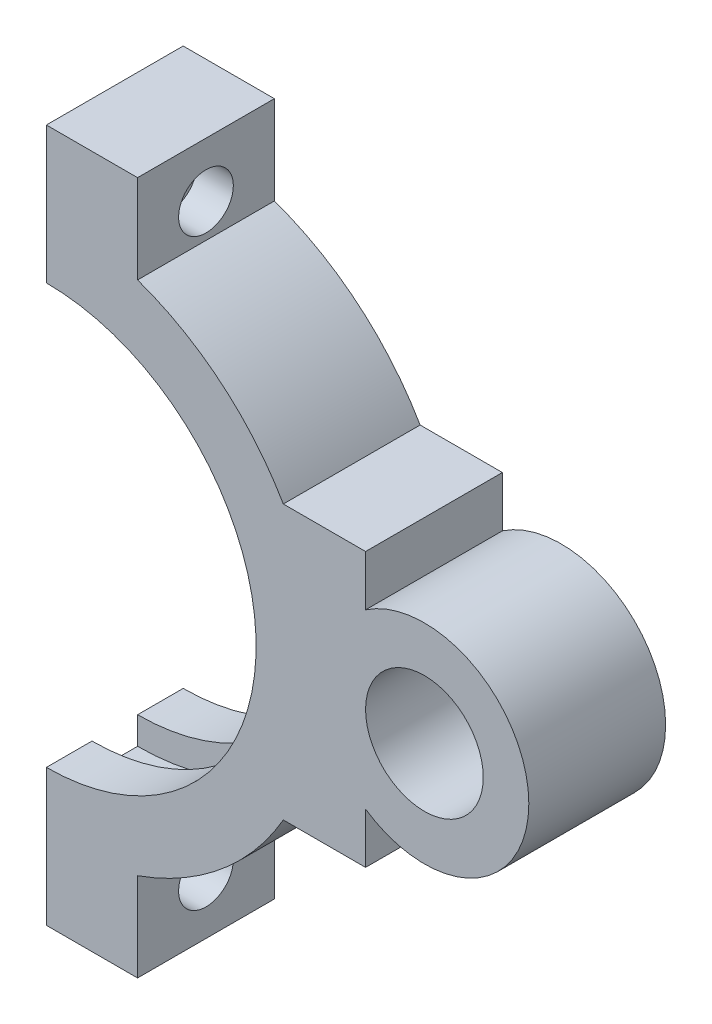
ISO-10303-21;
HEADER;
FILE_DESCRIPTION(('STEP AP214'),'2;1');
FILE_NAME('part.step','',(''),(''),'','','');
FILE_SCHEMA(('AUTOMOTIVE_DESIGN { 1 0 10303 214 1 1 1 1 }'));
ENDSEC;
DATA;
#1=APPLICATION_CONTEXT('core data for automotive mechanical design processes');
#2=APPLICATION_PROTOCOL_DEFINITION('international standard','automotive_design',2000,#1);
#3=PRODUCT_CONTEXT('',#1,'mechanical');
#4=PRODUCT('Part','Part','',(#3));
#5=PRODUCT_RELATED_PRODUCT_CATEGORY('part','',(#4));
#6=PRODUCT_DEFINITION_FORMATION('','',#4);
#7=PRODUCT_DEFINITION_CONTEXT('part definition',#1,'design');
#8=PRODUCT_DEFINITION('design','',#6,#7);
#9=PRODUCT_DEFINITION_SHAPE('','',#8);
#10=(LENGTH_UNIT() NAMED_UNIT(*) SI_UNIT(.MILLI.,.METRE.));
#11=(NAMED_UNIT(*) PLANE_ANGLE_UNIT() SI_UNIT($,.RADIAN.));
#12=(NAMED_UNIT(*) SI_UNIT($,.STERADIAN.) SOLID_ANGLE_UNIT());
#13=UNCERTAINTY_MEASURE_WITH_UNIT(LENGTH_MEASURE(1.E-05),#10,'distance_accuracy_value','');
#14=(GEOMETRIC_REPRESENTATION_CONTEXT(3) GLOBAL_UNCERTAINTY_ASSIGNED_CONTEXT((#13)) GLOBAL_UNIT_ASSIGNED_CONTEXT((#10,
#11,#12)) REPRESENTATION_CONTEXT('',''));
#15=CARTESIAN_POINT('',(0.,0.,0.));
#16=DIRECTION('',(0.,0.,1.));
#17=DIRECTION('',(1.,0.,0.));
#18=AXIS2_PLACEMENT_3D('',#15,#16,#17);
#19=CARTESIAN_POINT('',(15.,32.4850746268657,2.5));
#20=DIRECTION('',(-1.,0.,0.));
#21=DIRECTION('',(0.,0.,1.));
#22=AXIS2_PLACEMENT_3D('',#19,#20,#21);
#23=CYLINDRICAL_SURFACE('',#22,1.6);
#24=CARTESIAN_POINT('',(0.,32.4850746268657,2.5));
#25=DIRECTION('',(-1.,0.,0.));
#26=DIRECTION('',(0.,0.,1.));
#27=AXIS2_PLACEMENT_3D('',#24,#25,#26);
#28=CIRCLE('',#27,1.6);
#29=CARTESIAN_POINT('',(0.,32.4850746268657,4.1));
#30=VERTEX_POINT('',#29);
#31=EDGE_CURVE('E331',#30,#30,#28,.T.);
#32=ORIENTED_EDGE('',*,*,#31,.T.);
#33=EDGE_LOOP('',(#32));
#34=FACE_BOUND('',#33,.T.);
#35=CARTESIAN_POINT('',(6.,32.4850746268657,2.5));
#36=DIRECTION('',(1.,0.,0.));
#37=DIRECTION('',(0.,0.,-1.));
#38=AXIS2_PLACEMENT_3D('',#35,#36,#37);
#39=CIRCLE('',#38,1.6);
#40=CARTESIAN_POINT('',(6.,32.4850746268657,0.900000000000003));
#41=VERTEX_POINT('',#40);
#42=EDGE_CURVE('E37',#41,#41,#39,.F.);
#43=ORIENTED_EDGE('',*,*,#42,.F.);
#44=EDGE_LOOP('',(#43));
#45=FACE_BOUND('',#44,.T.);
#46=ADVANCED_FACE('F33',(#34,#45),#23,.F.);
#47=CARTESIAN_POINT('',(15.,-31.5149253731343,2.5));
#48=DIRECTION('',(-1.,0.,0.));
#49=DIRECTION('',(0.,0.,1.));
#50=AXIS2_PLACEMENT_3D('',#47,#48,#49);
#51=CYLINDRICAL_SURFACE('',#50,1.59999999999999);
#52=CARTESIAN_POINT('',(0.,-31.5149253731343,2.5));
#53=DIRECTION('',(-1.,0.,0.));
#54=DIRECTION('',(0.,0.,-1.));
#55=AXIS2_PLACEMENT_3D('',#52,#53,#54);
#56=CIRCLE('',#55,1.59999999999999);
#57=CARTESIAN_POINT('',(0.,-31.5149253731343,0.900000000000007));
#58=VERTEX_POINT('',#57);
#59=EDGE_CURVE('E316',#58,#58,#56,.T.);
#60=ORIENTED_EDGE('',*,*,#59,.T.);
#61=EDGE_LOOP('',(#60));
#62=FACE_BOUND('',#61,.T.);
#63=CARTESIAN_POINT('',(6.,-31.5149253731343,2.5));
#64=DIRECTION('',(1.,0.,0.));
#65=DIRECTION('',(0.,0.,-1.));
#66=AXIS2_PLACEMENT_3D('',#63,#64,#65);
#67=CIRCLE('',#66,1.59999999999999);
#68=CARTESIAN_POINT('',(6.,-31.5149253731343,0.900000000000007));
#69=VERTEX_POINT('',#68);
#70=EDGE_CURVE('E310',#69,#69,#67,.F.);
#71=ORIENTED_EDGE('',*,*,#70,.F.);
#72=EDGE_LOOP('',(#71));
#73=FACE_BOUND('',#72,.T.);
#74=ADVANCED_FACE('F336',(#62,#73),#51,.F.);
#75=CARTESIAN_POINT('',(0.,0.485074626865662,5.));
#76=DIRECTION('',(0.,0.,-1.));
#77=DIRECTION('',(-1.,0.,0.));
#78=AXIS2_PLACEMENT_3D('',#75,#76,#77);
#79=CYLINDRICAL_SURFACE('',#78,26.);
#80=CARTESIAN_POINT('',(0.,0.485074626865662,0.));
#81=DIRECTION('',(0.,0.,-1.));
#82=DIRECTION('',(-1.,0.,0.));
#83=AXIS2_PLACEMENT_3D('',#80,#81,#82);
#84=CIRCLE('',#83,26.);
#85=CARTESIAN_POINT('',(0.,26.4850746268657,0.));
#86=VERTEX_POINT('',#85);
#87=CARTESIAN_POINT('',(0.,-25.5149253731343,0.));
#88=VERTEX_POINT('',#87);
#89=EDGE_CURVE('E284',#86,#88,#84,.T.);
#90=ORIENTED_EDGE('',*,*,#89,.T.);
#91=DIRECTION('',(0.,0.,-1.));
#92=VECTOR('',#91,1.);
#93=CARTESIAN_POINT('',(0.,-25.5149253731343,5.));
#94=LINE('',#93,#92);
#95=CARTESIAN_POINT('',(4.8287090326281E-13,-25.5149253731343,5.));
#96=VERTEX_POINT('',#95);
#97=EDGE_CURVE('E11',#96,#88,#94,.T.);
#98=ORIENTED_EDGE('',*,*,#97,.F.);
#99=CARTESIAN_POINT('',(0.,0.485074626865662,5.));
#100=DIRECTION('',(0.,0.,-1.));
#101=DIRECTION('',(-1.,0.,0.));
#102=AXIS2_PLACEMENT_3D('',#99,#100,#101);
#103=CIRCLE('',#102,26.);
#104=CARTESIAN_POINT('',(0.,26.4850746268657,5.));
#105=VERTEX_POINT('',#104);
#106=EDGE_CURVE('E285',#105,#96,#103,.T.);
#107=ORIENTED_EDGE('',*,*,#106,.F.);
#108=DIRECTION('',(0.,0.,-1.));
#109=VECTOR('',#108,1.);
#110=CARTESIAN_POINT('',(0.,26.4850746268657,5.));
#111=LINE('',#110,#109);
#112=EDGE_CURVE('E50',#105,#86,#111,.T.);
#113=ORIENTED_EDGE('',*,*,#112,.T.);
#114=EDGE_LOOP('',(#90,#98,#107,#113));
#115=FACE_BOUND('',#114,.T.);
#116=ADVANCED_FACE('F35',(#115),#79,.F.);
#117=CARTESIAN_POINT('',(0.,-29.5149253731343,5.));
#118=DIRECTION('',(1.,0.,0.));
#119=DIRECTION('',(0.,1.,0.));
#120=AXIS2_PLACEMENT_3D('',#117,#118,#119);
#121=PLANE('',#120);
#122=ORIENTED_EDGE('',*,*,#59,.F.);
#123=EDGE_LOOP('',(#122));
#124=FACE_BOUND('',#123,.T.);
#125=ORIENTED_EDGE('',*,*,#97,.T.);
#126=DIRECTION('',(0.,1.,0.));
#127=VECTOR('',#126,1.);
#128=CARTESIAN_POINT('',(-2.40728515360304E-13,-22.5149253731343,0.));
#129=LINE('',#128,#127);
#130=CARTESIAN_POINT('',(-2.39542577778584E-13,-22.5149253731343,0.));
#131=VERTEX_POINT('',#130);
#132=EDGE_CURVE('E222',#88,#131,#129,.T.);
#133=ORIENTED_EDGE('',*,*,#132,.T.);
#134=DIRECTION('',(0.,0.,1.));
#135=VECTOR('',#134,1.);
#136=CARTESIAN_POINT('',(-2.39542577778584E-13,-22.5149253731343,-5.));
#137=LINE('',#136,#135);
#138=CARTESIAN_POINT('',(-2.39542577778584E-13,-22.5149253731343,-5.));
#139=VERTEX_POINT('',#138);
#140=EDGE_CURVE('E226',#139,#131,#137,.T.);
#141=ORIENTED_EDGE('',*,*,#140,.F.);
#142=DIRECTION('',(0.,1.,0.));
#143=VECTOR('',#142,1.);
#144=CARTESIAN_POINT('',(0.,-37.5149253731343,-5.));
#145=LINE('',#144,#143);
#146=CARTESIAN_POINT('',(0.,-37.5149253731343,-5.));
#147=VERTEX_POINT('',#146);
#148=EDGE_CURVE('E218',#147,#139,#145,.T.);
#149=ORIENTED_EDGE('',*,*,#148,.F.);
#150=DIRECTION('',(0.,0.,-1.));
#151=VECTOR('',#150,1.);
#152=CARTESIAN_POINT('',(0.,-37.5149253731343,5.));
#153=LINE('',#152,#151);
#154=CARTESIAN_POINT('',(0.,-37.5149253731343,10.));
#155=VERTEX_POINT('',#154);
#156=EDGE_CURVE('E43',#155,#147,#153,.T.);
#157=ORIENTED_EDGE('',*,*,#156,.F.);
#158=DIRECTION('',(0.,-1.,0.));
#159=VECTOR('',#158,1.);
#160=CARTESIAN_POINT('',(0.,-25.5149253731343,10.));
#161=LINE('',#160,#159);
#162=CARTESIAN_POINT('',(0.,-22.5149253731343,10.));
#163=VERTEX_POINT('',#162);
#164=EDGE_CURVE('E237',#163,#155,#161,.T.);
#165=ORIENTED_EDGE('',*,*,#164,.F.);
#166=DIRECTION('',(0.,0.,-1.));
#167=VECTOR('',#166,1.);
#168=CARTESIAN_POINT('',(0.,-22.5149253731343,10.));
#169=LINE('',#168,#167);
#170=CARTESIAN_POINT('',(0.,-22.5149253731343,5.));
#171=VERTEX_POINT('',#170);
#172=EDGE_CURVE('E272',#163,#171,#169,.T.);
#173=ORIENTED_EDGE('',*,*,#172,.T.);
#174=DIRECTION('',(0.,-1.,0.));
#175=VECTOR('',#174,1.);
#176=CARTESIAN_POINT('',(3.2191393550854E-13,-29.5149253731343,5.));
#177=LINE('',#176,#175);
#178=EDGE_CURVE('E275',#171,#96,#177,.T.);
#179=ORIENTED_EDGE('',*,*,#178,.T.);
#180=EDGE_LOOP('',(#125,#133,#141,#149,#157,#165,#173,#179));
#181=FACE_BOUND('',#180,.T.);
#182=ADVANCED_FACE('F339',(#124,#181),#121,.F.);
#183=CARTESIAN_POINT('',(0.,-37.5149253731343,5.));
#184=DIRECTION('',(0.,1.,0.));
#185=DIRECTION('',(0.,0.,1.));
#186=AXIS2_PLACEMENT_3D('',#183,#184,#185);
#187=PLANE('',#186);
#188=ORIENTED_EDGE('',*,*,#156,.T.);
#189=DIRECTION('',(-1.,0.,0.));
#190=VECTOR('',#189,1.);
#191=CARTESIAN_POINT('',(10.,-37.5149253731343,-5.));
#192=LINE('',#191,#190);
#193=CARTESIAN_POINT('',(10.,-37.5149253731343,-5.));
#194=VERTEX_POINT('',#193);
#195=EDGE_CURVE('E215',#194,#147,#192,.T.);
#196=ORIENTED_EDGE('',*,*,#195,.F.);
#197=DIRECTION('',(0.,0.,-1.));
#198=VECTOR('',#197,1.);
#199=CARTESIAN_POINT('',(10.,-37.5149253731343,5.));
#200=LINE('',#199,#198);
#201=CARTESIAN_POINT('',(10.,-37.5149253731343,10.));
#202=VERTEX_POINT('',#201);
#203=EDGE_CURVE('E308',#202,#194,#200,.T.);
#204=ORIENTED_EDGE('',*,*,#203,.F.);
#205=DIRECTION('',(1.,0.,0.));
#206=VECTOR('',#205,1.);
#207=CARTESIAN_POINT('',(0.,-37.5149253731343,10.));
#208=LINE('',#207,#206);
#209=EDGE_CURVE('E240',#155,#202,#208,.T.);
#210=ORIENTED_EDGE('',*,*,#209,.F.);
#211=EDGE_LOOP('',(#188,#196,#204,#210));
#212=FACE_BOUND('',#211,.T.);
#213=ADVANCED_FACE('F342',(#212),#187,.F.);
#214=CARTESIAN_POINT('',(10.,-37.5149253731343,5.));
#215=DIRECTION('',(-1.,0.,0.));
#216=DIRECTION('',(0.,0.,1.));
#217=AXIS2_PLACEMENT_3D('',#214,#215,#216);
#218=PLANE('',#217);
#219=CARTESIAN_POINT('',(10.,-31.5149253731343,2.5));
#220=DIRECTION('',(1.,0.,0.));
#221=DIRECTION('',(0.,0.,-1.));
#222=AXIS2_PLACEMENT_3D('',#219,#220,#221);
#223=CIRCLE('',#222,3.);
#224=CARTESIAN_POINT('',(10.,-31.5149253731343,-0.5));
#225=VERTEX_POINT('',#224);
#226=EDGE_CURVE('E318',#225,#225,#223,.T.);
#227=ORIENTED_EDGE('',*,*,#226,.F.);
#228=EDGE_LOOP('',(#227));
#229=FACE_BOUND('',#228,.T.);
#230=ORIENTED_EDGE('',*,*,#203,.T.);
#231=DIRECTION('',(0.,-1.,0.));
#232=VECTOR('',#231,1.);
#233=CARTESIAN_POINT('',(10.,-27.7991966205962,-5.));
#234=LINE('',#233,#232);
#235=CARTESIAN_POINT('',(10.,-27.7991966205962,-5.));
#236=VERTEX_POINT('',#235);
#237=EDGE_CURVE('E212',#236,#194,#234,.T.);
#238=ORIENTED_EDGE('',*,*,#237,.F.);
#239=DIRECTION('',(0.,0.,-1.));
#240=VECTOR('',#239,1.);
#241=CARTESIAN_POINT('',(10.,-27.7991966205962,5.));
#242=LINE('',#241,#240);
#243=CARTESIAN_POINT('',(10.,-27.7991966205962,10.));
#244=VERTEX_POINT('',#243);
#245=EDGE_CURVE('E306',#244,#236,#242,.T.);
#246=ORIENTED_EDGE('',*,*,#245,.F.);
#247=DIRECTION('',(0.,1.,0.));
#248=VECTOR('',#247,1.);
#249=CARTESIAN_POINT('',(10.,-37.5149253731343,10.));
#250=LINE('',#249,#248);
#251=EDGE_CURVE('E243',#202,#244,#250,.T.);
#252=ORIENTED_EDGE('',*,*,#251,.F.);
#253=EDGE_LOOP('',(#230,#238,#246,#252));
#254=FACE_BOUND('',#253,.T.);
#255=ADVANCED_FACE('F363',(#229,#254),#218,.F.);
#256=CARTESIAN_POINT('',(0.,0.485074626865662,5.));
#257=DIRECTION('',(0.,0.,-1.));
#258=DIRECTION('',(-1.,0.,0.));
#259=AXIS2_PLACEMENT_3D('',#256,#257,#258);
#260=CYLINDRICAL_SURFACE('',#259,30.);
#261=ORIENTED_EDGE('',*,*,#245,.T.);
#262=CARTESIAN_POINT('',(-1.97758476261356E-13,0.485074626866016,-5.));
#263=DIRECTION('',(0.,0.,-1.));
#264=DIRECTION('',(-1.,0.,0.));
#265=AXIS2_PLACEMENT_3D('',#262,#263,#264);
#266=CIRCLE('',#265,30.0000000000004);
#267=CARTESIAN_POINT('',(25.9807621135332,-14.5149253731343,-5.));
#268=VERTEX_POINT('',#267);
#269=EDGE_CURVE('E209',#268,#236,#266,.T.);
#270=ORIENTED_EDGE('',*,*,#269,.F.);
#271=DIRECTION('',(0.,0.,-1.));
#272=VECTOR('',#271,1.);
#273=CARTESIAN_POINT('',(25.9807621135332,-14.5149253731343,5.));
#274=LINE('',#273,#272);
#275=CARTESIAN_POINT('',(25.9807621135332,-14.5149253731343,10.));
#276=VERTEX_POINT('',#275);
#277=EDGE_CURVE('E304',#276,#268,#274,.T.);
#278=ORIENTED_EDGE('',*,*,#277,.F.);
#279=CARTESIAN_POINT('',(0.,0.485074626865662,10.));
#280=DIRECTION('',(0.,0.,1.));
#281=DIRECTION('',(-1.,0.,0.));
#282=AXIS2_PLACEMENT_3D('',#279,#280,#281);
#283=CIRCLE('',#282,30.);
#284=EDGE_CURVE('E246',#244,#276,#283,.T.);
#285=ORIENTED_EDGE('',*,*,#284,.F.);
#286=EDGE_LOOP('',(#261,#270,#278,#285));
#287=FACE_BOUND('',#286,.T.);
#288=ADVANCED_FACE('F366',(#287),#260,.T.);
#289=CARTESIAN_POINT('',(25.9807621135332,-14.5149253731343,5.));
#290=DIRECTION('',(0.,1.,0.));
#291=DIRECTION('',(0.,0.,1.));
#292=AXIS2_PLACEMENT_3D('',#289,#290,#291);
#293=PLANE('',#292);
#294=ORIENTED_EDGE('',*,*,#277,.T.);
#295=DIRECTION('',(-1.,0.,0.));
#296=VECTOR('',#295,1.);
#297=CARTESIAN_POINT('',(35.,-14.5149253731343,-5.));
#298=LINE('',#297,#296);
#299=CARTESIAN_POINT('',(35.,-14.5149253731343,-5.));
#300=VERTEX_POINT('',#299);
#301=EDGE_CURVE('E206',#300,#268,#298,.T.);
#302=ORIENTED_EDGE('',*,*,#301,.F.);
#303=DIRECTION('',(0.,0.,-1.));
#304=VECTOR('',#303,1.);
#305=CARTESIAN_POINT('',(35.,-14.5149253731343,5.));
#306=LINE('',#305,#304);
#307=CARTESIAN_POINT('',(35.,-14.5149253731343,10.));
#308=VERTEX_POINT('',#307);
#309=EDGE_CURVE('E302',#308,#300,#306,.T.);
#310=ORIENTED_EDGE('',*,*,#309,.F.);
#311=DIRECTION('',(1.,0.,0.));
#312=VECTOR('',#311,1.);
#313=CARTESIAN_POINT('',(35.,-14.5149253731343,10.));
#314=LINE('',#313,#312);
#315=EDGE_CURVE('E249',#276,#308,#314,.T.);
#316=ORIENTED_EDGE('',*,*,#315,.F.);
#317=EDGE_LOOP('',(#294,#302,#310,#316));
#318=FACE_BOUND('',#317,.T.);
#319=ADVANCED_FACE('F370',(#318),#293,.F.);
#320=CARTESIAN_POINT('',(35.,-14.5149253731343,5.));
#321=DIRECTION('',(-1.,0.,0.));
#322=DIRECTION('',(0.,-1.,0.));
#323=AXIS2_PLACEMENT_3D('',#320,#321,#322);
#324=PLANE('',#323);
#325=ORIENTED_EDGE('',*,*,#309,.T.);
#326=DIRECTION('',(0.,-1.,0.));
#327=VECTOR('',#326,1.);
#328=CARTESIAN_POINT('',(35.,-14.5149253731343,-5.));
#329=LINE('',#328,#327);
#330=CARTESIAN_POINT('',(35.,-8.9753693373466,-5.));
#331=VERTEX_POINT('',#330);
#332=EDGE_CURVE('E203',#331,#300,#329,.T.);
#333=ORIENTED_EDGE('',*,*,#332,.F.);
#334=DIRECTION('',(0.,0.,-1.));
#335=VECTOR('',#334,1.);
#336=CARTESIAN_POINT('',(35.,-8.9753693373466,5.));
#337=LINE('',#336,#335);
#338=CARTESIAN_POINT('',(35.,-8.9753693373466,10.));
#339=VERTEX_POINT('',#338);
#340=EDGE_CURVE('E300',#339,#331,#337,.T.);
#341=ORIENTED_EDGE('',*,*,#340,.F.);
#342=DIRECTION('',(0.,1.,0.));
#343=VECTOR('',#342,1.);
#344=CARTESIAN_POINT('',(35.,-8.9753693373466,10.));
#345=LINE('',#344,#343);
#346=EDGE_CURVE('E252',#308,#339,#345,.T.);
#347=ORIENTED_EDGE('',*,*,#346,.F.);
#348=EDGE_LOOP('',(#325,#333,#341,#347));
#349=FACE_BOUND('',#348,.T.);
#350=ADVANCED_FACE('F375',(#349),#324,.F.);
#351=CARTESIAN_POINT('',(41.45,0.485074626865669,5.));
#352=DIRECTION('',(0.,0.,-1.));
#353=DIRECTION('',(-1.,0.,0.));
#354=AXIS2_PLACEMENT_3D('',#351,#352,#353);
#355=CYLINDRICAL_SURFACE('',#354,11.45);
#356=ORIENTED_EDGE('',*,*,#340,.T.);
#357=CARTESIAN_POINT('',(41.45,0.485074626865669,-5.));
#358=DIRECTION('',(0.,0.,-1.));
#359=DIRECTION('',(-1.,0.,0.));
#360=AXIS2_PLACEMENT_3D('',#357,#358,#359);
#361=CIRCLE('',#360,11.45);
#362=CARTESIAN_POINT('',(35.,9.94551859107794,-5.));
#363=VERTEX_POINT('',#362);
#364=EDGE_CURVE('E200',#363,#331,#361,.T.);
#365=ORIENTED_EDGE('',*,*,#364,.F.);
#366=DIRECTION('',(0.,0.,-1.));
#367=VECTOR('',#366,1.);
#368=CARTESIAN_POINT('',(35.,9.94551859107794,5.));
#369=LINE('',#368,#367);
#370=CARTESIAN_POINT('',(35.,9.94551859107794,10.));
#371=VERTEX_POINT('',#370);
#372=EDGE_CURVE('E298',#371,#363,#369,.T.);
#373=ORIENTED_EDGE('',*,*,#372,.F.);
#374=CARTESIAN_POINT('',(41.45,0.485074626865669,10.));
#375=DIRECTION('',(0.,0.,1.));
#376=DIRECTION('',(-1.,0.,0.));
#377=AXIS2_PLACEMENT_3D('',#374,#375,#376);
#378=CIRCLE('',#377,11.45);
#379=EDGE_CURVE('E255',#339,#371,#378,.T.);
#380=ORIENTED_EDGE('',*,*,#379,.F.);
#381=EDGE_LOOP('',(#356,#365,#373,#380));
#382=FACE_BOUND('',#381,.T.);
#383=ADVANCED_FACE('F378',(#382),#355,.T.);
#384=CARTESIAN_POINT('',(35.,9.94551859107794,5.));
#385=DIRECTION('',(-1.,0.,0.));
#386=DIRECTION('',(0.,-1.,0.));
#387=AXIS2_PLACEMENT_3D('',#384,#385,#386);
#388=PLANE('',#387);
#389=ORIENTED_EDGE('',*,*,#372,.T.);
#390=DIRECTION('',(0.,-1.,0.));
#391=VECTOR('',#390,1.);
#392=CARTESIAN_POINT('',(35.,15.4850746268657,-5.));
#393=LINE('',#392,#391);
#394=CARTESIAN_POINT('',(35.,15.4850746268657,-5.));
#395=VERTEX_POINT('',#394);
#396=EDGE_CURVE('E197',#395,#363,#393,.T.);
#397=ORIENTED_EDGE('',*,*,#396,.F.);
#398=DIRECTION('',(0.,0.,-1.));
#399=VECTOR('',#398,1.);
#400=CARTESIAN_POINT('',(35.,15.4850746268657,5.));
#401=LINE('',#400,#399);
#402=CARTESIAN_POINT('',(35.,15.4850746268657,10.));
#403=VERTEX_POINT('',#402);
#404=EDGE_CURVE('E296',#403,#395,#401,.T.);
#405=ORIENTED_EDGE('',*,*,#404,.F.);
#406=DIRECTION('',(0.,1.,0.));
#407=VECTOR('',#406,1.);
#408=CARTESIAN_POINT('',(35.,15.4850746268657,10.));
#409=LINE('',#408,#407);
#410=EDGE_CURVE('E258',#371,#403,#409,.T.);
#411=ORIENTED_EDGE('',*,*,#410,.F.);
#412=EDGE_LOOP('',(#389,#397,#405,#411));
#413=FACE_BOUND('',#412,.T.);
#414=ADVANCED_FACE('F382',(#413),#388,.F.);
#415=CARTESIAN_POINT('',(25.9807621135332,15.4850746268657,5.));
#416=DIRECTION('',(0.,-1.,0.));
#417=DIRECTION('',(0.,0.,-1.));
#418=AXIS2_PLACEMENT_3D('',#415,#416,#417);
#419=PLANE('',#418);
#420=ORIENTED_EDGE('',*,*,#404,.T.);
#421=DIRECTION('',(1.,0.,0.));
#422=VECTOR('',#421,1.);
#423=CARTESIAN_POINT('',(25.9807621135332,15.4850746268657,-5.));
#424=LINE('',#423,#422);
#425=CARTESIAN_POINT('',(25.9807621135332,15.4850746268657,-5.));
#426=VERTEX_POINT('',#425);
#427=EDGE_CURVE('E194',#426,#395,#424,.T.);
#428=ORIENTED_EDGE('',*,*,#427,.F.);
#429=DIRECTION('',(0.,0.,-1.));
#430=VECTOR('',#429,1.);
#431=CARTESIAN_POINT('',(25.9807621135332,15.4850746268657,5.));
#432=LINE('',#431,#430);
#433=CARTESIAN_POINT('',(25.9807621135332,15.4850746268657,10.));
#434=VERTEX_POINT('',#433);
#435=EDGE_CURVE('E294',#434,#426,#432,.T.);
#436=ORIENTED_EDGE('',*,*,#435,.F.);
#437=DIRECTION('',(-1.,0.,0.));
#438=VECTOR('',#437,1.);
#439=CARTESIAN_POINT('',(25.9807621135332,15.4850746268657,10.));
#440=LINE('',#439,#438);
#441=EDGE_CURVE('E261',#403,#434,#440,.T.);
#442=ORIENTED_EDGE('',*,*,#441,.F.);
#443=EDGE_LOOP('',(#420,#428,#436,#442));
#444=FACE_BOUND('',#443,.T.);
#445=ADVANCED_FACE('F387',(#444),#419,.F.);
#446=CARTESIAN_POINT('',(0.,0.485074626865662,5.));
#447=DIRECTION('',(0.,0.,-1.));
#448=DIRECTION('',(-1.,0.,0.));
#449=AXIS2_PLACEMENT_3D('',#446,#447,#448);
#450=CYLINDRICAL_SURFACE('',#449,30.);
#451=ORIENTED_EDGE('',*,*,#435,.T.);
#452=CARTESIAN_POINT('',(-1.31838984174237E-13,0.485074626865423,-5.));
#453=DIRECTION('',(0.,0.,-1.));
#454=DIRECTION('',(-1.,0.,0.));
#455=AXIS2_PLACEMENT_3D('',#452,#453,#454);
#456=CIRCLE('',#455,30.0000000000003);
#457=CARTESIAN_POINT('',(9.99999999999999,28.7693458743275,-5.));
#458=VERTEX_POINT('',#457);
#459=EDGE_CURVE('E191',#458,#426,#456,.T.);
#460=ORIENTED_EDGE('',*,*,#459,.F.);
#461=DIRECTION('',(0.,0.,-1.));
#462=VECTOR('',#461,1.);
#463=CARTESIAN_POINT('',(10.,28.7693458743276,5.));
#464=LINE('',#463,#462);
#465=CARTESIAN_POINT('',(9.99999999999999,28.7693458743275,10.));
#466=VERTEX_POINT('',#465);
#467=EDGE_CURVE('E292',#466,#458,#464,.T.);
#468=ORIENTED_EDGE('',*,*,#467,.F.);
#469=CARTESIAN_POINT('',(-2.4459601011273E-13,0.485074626865228,10.));
#470=DIRECTION('',(0.,0.,1.));
#471=DIRECTION('',(-1.,0.,0.));
#472=AXIS2_PLACEMENT_3D('',#469,#470,#471);
#473=CIRCLE('',#472,30.0000000000005);
#474=EDGE_CURVE('E264',#434,#466,#473,.T.);
#475=ORIENTED_EDGE('',*,*,#474,.F.);
#476=EDGE_LOOP('',(#451,#460,#468,#475));
#477=FACE_BOUND('',#476,.T.);
#478=ADVANCED_FACE('F390',(#477),#450,.T.);
#479=CARTESIAN_POINT('',(10.,38.4850746268657,5.));
#480=DIRECTION('',(-1.,0.,0.));
#481=DIRECTION('',(0.,0.,1.));
#482=AXIS2_PLACEMENT_3D('',#479,#480,#481);
#483=PLANE('',#482);
#484=CARTESIAN_POINT('',(10.,32.4850746268657,2.5));
#485=DIRECTION('',(1.,0.,0.));
#486=DIRECTION('',(0.,0.,-1.));
#487=AXIS2_PLACEMENT_3D('',#484,#485,#486);
#488=CIRCLE('',#487,3.);
#489=CARTESIAN_POINT('',(10.,32.4850746268657,-0.5));
#490=VERTEX_POINT('',#489);
#491=EDGE_CURVE('E328',#490,#490,#488,.T.);
#492=ORIENTED_EDGE('',*,*,#491,.F.);
#493=EDGE_LOOP('',(#492));
#494=FACE_BOUND('',#493,.T.);
#495=ORIENTED_EDGE('',*,*,#467,.T.);
#496=DIRECTION('',(0.,-1.,0.));
#497=VECTOR('',#496,1.);
#498=CARTESIAN_POINT('',(10.,38.4850746268657,-5.));
#499=LINE('',#498,#497);
#500=CARTESIAN_POINT('',(10.,38.4850746268657,-5.));
#501=VERTEX_POINT('',#500);
#502=EDGE_CURVE('E175',#501,#458,#499,.T.);
#503=ORIENTED_EDGE('',*,*,#502,.F.);
#504=DIRECTION('',(0.,0.,-1.));
#505=VECTOR('',#504,1.);
#506=CARTESIAN_POINT('',(10.,38.4850746268657,5.));
#507=LINE('',#506,#505);
#508=CARTESIAN_POINT('',(10.,38.4850746268657,10.));
#509=VERTEX_POINT('',#508);
#510=EDGE_CURVE('E167',#509,#501,#507,.T.);
#511=ORIENTED_EDGE('',*,*,#510,.F.);
#512=DIRECTION('',(0.,1.,0.));
#513=VECTOR('',#512,1.);
#514=CARTESIAN_POINT('',(10.,38.4850746268657,10.));
#515=LINE('',#514,#513);
#516=EDGE_CURVE('E267',#466,#509,#515,.T.);
#517=ORIENTED_EDGE('',*,*,#516,.F.);
#518=EDGE_LOOP('',(#495,#503,#511,#517));
#519=FACE_BOUND('',#518,.T.);
#520=ADVANCED_FACE('F392',(#494,#519),#483,.F.);
#521=CARTESIAN_POINT('',(0.,38.4850746268657,5.));
#522=DIRECTION('',(0.,-1.,0.));
#523=DIRECTION('',(0.,0.,-1.));
#524=AXIS2_PLACEMENT_3D('',#521,#522,#523);
#525=PLANE('',#524);
#526=ORIENTED_EDGE('',*,*,#510,.T.);
#527=DIRECTION('',(1.,0.,0.));
#528=VECTOR('',#527,1.);
#529=CARTESIAN_POINT('',(0.,38.4850746268657,-5.));
#530=LINE('',#529,#528);
#531=CARTESIAN_POINT('',(0.,38.4850746268657,-5.));
#532=VERTEX_POINT('',#531);
#533=EDGE_CURVE('E170',#532,#501,#530,.T.);
#534=ORIENTED_EDGE('',*,*,#533,.F.);
#535=DIRECTION('',(0.,0.,-1.));
#536=VECTOR('',#535,1.);
#537=CARTESIAN_POINT('',(0.,38.4850746268657,5.));
#538=LINE('',#537,#536);
#539=CARTESIAN_POINT('',(0.,38.4850746268657,10.));
#540=VERTEX_POINT('',#539);
#541=EDGE_CURVE('E155',#540,#532,#538,.T.);
#542=ORIENTED_EDGE('',*,*,#541,.F.);
#543=DIRECTION('',(-1.,0.,0.));
#544=VECTOR('',#543,1.);
#545=CARTESIAN_POINT('',(0.,38.4850746268657,10.));
#546=LINE('',#545,#544);
#547=EDGE_CURVE('E270',#509,#540,#546,.T.);
#548=ORIENTED_EDGE('',*,*,#547,.F.);
#549=EDGE_LOOP('',(#526,#534,#542,#548));
#550=FACE_BOUND('',#549,.T.);
#551=ADVANCED_FACE('F171',(#550),#525,.F.);
#552=CARTESIAN_POINT('',(0.,26.4850746268657,5.));
#553=DIRECTION('',(1.,0.,0.));
#554=DIRECTION('',(0.,0.,-1.));
#555=AXIS2_PLACEMENT_3D('',#552,#553,#554);
#556=PLANE('',#555);
#557=ORIENTED_EDGE('',*,*,#31,.F.);
#558=EDGE_LOOP('',(#557));
#559=FACE_BOUND('',#558,.T.);
#560=ORIENTED_EDGE('',*,*,#541,.T.);
#561=DIRECTION('',(0.,1.,0.));
#562=VECTOR('',#561,1.);
#563=CARTESIAN_POINT('',(1.12425055177952E-13,30.4850746268657,-5.));
#564=LINE('',#563,#562);
#565=CARTESIAN_POINT('',(0.,23.4850746268657,-5.));
#566=VERTEX_POINT('',#565);
#567=EDGE_CURVE('E160',#566,#532,#564,.T.);
#568=ORIENTED_EDGE('',*,*,#567,.F.);
#569=DIRECTION('',(0.,0.,1.));
#570=VECTOR('',#569,1.);
#571=CARTESIAN_POINT('',(0.,23.4850746268657,-5.));
#572=LINE('',#571,#570);
#573=CARTESIAN_POINT('',(0.,23.4850746268657,0.));
#574=VERTEX_POINT('',#573);
#575=EDGE_CURVE('E221',#566,#574,#572,.T.);
#576=ORIENTED_EDGE('',*,*,#575,.T.);
#577=DIRECTION('',(0.,1.,0.));
#578=VECTOR('',#577,1.);
#579=CARTESIAN_POINT('',(1.12425055177952E-13,30.4850746268657,0.));
#580=LINE('',#579,#578);
#581=EDGE_CURVE('E182',#574,#86,#580,.T.);
#582=ORIENTED_EDGE('',*,*,#581,.T.);
#583=ORIENTED_EDGE('',*,*,#112,.F.);
#584=DIRECTION('',(0.,-1.,0.));
#585=VECTOR('',#584,1.);
#586=CARTESIAN_POINT('',(0.,30.4850746268657,5.));
#587=LINE('',#586,#585);
#588=CARTESIAN_POINT('',(0.,23.4850746268657,5.));
#589=VERTEX_POINT('',#588);
#590=EDGE_CURVE('E235',#105,#589,#587,.T.);
#591=ORIENTED_EDGE('',*,*,#590,.T.);
#592=DIRECTION('',(0.,0.,-1.));
#593=VECTOR('',#592,1.);
#594=CARTESIAN_POINT('',(0.,23.4850746268657,10.));
#595=LINE('',#594,#593);
#596=CARTESIAN_POINT('',(0.,23.4850746268657,10.));
#597=VERTEX_POINT('',#596);
#598=EDGE_CURVE('E281',#597,#589,#595,.T.);
#599=ORIENTED_EDGE('',*,*,#598,.F.);
#600=DIRECTION('',(0.,-1.,0.));
#601=VECTOR('',#600,1.);
#602=CARTESIAN_POINT('',(0.,26.4850746268657,10.));
#603=LINE('',#602,#601);
#604=EDGE_CURVE('E163',#540,#597,#603,.T.);
#605=ORIENTED_EDGE('',*,*,#604,.F.);
#606=EDGE_LOOP('',(#560,#568,#576,#582,#583,#591,#599,#605));
#607=FACE_BOUND('',#606,.T.);
#608=ADVANCED_FACE('F157',(#559,#607),#556,.F.);
#609=CARTESIAN_POINT('',(41.45,0.485074626865669,5.));
#610=DIRECTION('',(0.,0.,-1.));
#611=DIRECTION('',(-1.,0.,0.));
#612=AXIS2_PLACEMENT_3D('',#609,#610,#611);
#613=CYLINDRICAL_SURFACE('',#612,6.45);
#614=CARTESIAN_POINT('',(41.45,0.485074626865669,10.));
#615=DIRECTION('',(0.,0.,1.));
#616=DIRECTION('',(1.,0.,0.));
#617=AXIS2_PLACEMENT_3D('',#614,#615,#616);
#618=CIRCLE('',#617,6.44999999999999);
#619=CARTESIAN_POINT('',(47.9,0.485074626865669,10.));
#620=VERTEX_POINT('',#619);
#621=EDGE_CURVE('E229',#620,#620,#618,.T.);
#622=ORIENTED_EDGE('',*,*,#621,.T.);
#623=EDGE_LOOP('',(#622));
#624=FACE_BOUND('',#623,.T.);
#625=CARTESIAN_POINT('',(41.45,0.485074626865669,-5.));
#626=DIRECTION('',(0.,0.,-1.));
#627=DIRECTION('',(-1.,0.,0.));
#628=AXIS2_PLACEMENT_3D('',#625,#626,#627);
#629=CIRCLE('',#628,6.44999999999999);
#630=CARTESIAN_POINT('',(35.,0.485074626865669,-5.));
#631=VERTEX_POINT('',#630);
#632=EDGE_CURVE('E187',#631,#631,#629,.T.);
#633=ORIENTED_EDGE('',*,*,#632,.T.);
#634=EDGE_LOOP('',(#633));
#635=FACE_BOUND('',#634,.T.);
#636=ADVANCED_FACE('F403',(#624,#635),#613,.F.);
#637=CARTESIAN_POINT('',(-2.4459601011273E-13,0.485074626865228,5.));
#638=DIRECTION('',(0.,0.,-1.));
#639=DIRECTION('',(-1.,0.,0.));
#640=AXIS2_PLACEMENT_3D('',#637,#638,#639);
#641=PLANE('',#640);
#642=ORIENTED_EDGE('',*,*,#590,.F.);
#643=ORIENTED_EDGE('',*,*,#106,.T.);
#644=ORIENTED_EDGE('',*,*,#178,.F.);
#645=CARTESIAN_POINT('',(0.,0.485074626865662,5.));
#646=DIRECTION('',(0.,0.,-1.));
#647=DIRECTION('',(-1.,0.,0.));
#648=AXIS2_PLACEMENT_3D('',#645,#646,#647);
#649=CIRCLE('',#648,23.);
#650=EDGE_CURVE('E232',#589,#171,#649,.T.);
#651=ORIENTED_EDGE('',*,*,#650,.F.);
#652=EDGE_LOOP('',(#642,#643,#644,#651));
#653=FACE_BOUND('',#652,.T.);
#654=ADVANCED_FACE('F401',(#653),#641,.T.);
#655=CARTESIAN_POINT('',(-2.4459601011273E-13,0.485074626865228,10.));
#656=DIRECTION('',(0.,0.,-1.));
#657=DIRECTION('',(-1.,0.,0.));
#658=AXIS2_PLACEMENT_3D('',#655,#656,#657);
#659=PLANE('',#658);
#660=ORIENTED_EDGE('',*,*,#604,.T.);
#661=CARTESIAN_POINT('',(0.,0.485074626865662,10.));
#662=DIRECTION('',(0.,0.,-1.));
#663=DIRECTION('',(-1.,0.,0.));
#664=AXIS2_PLACEMENT_3D('',#661,#662,#663);
#665=CIRCLE('',#664,23.);
#666=EDGE_CURVE('E234',#597,#163,#665,.T.);
#667=ORIENTED_EDGE('',*,*,#666,.T.);
#668=ORIENTED_EDGE('',*,*,#164,.T.);
#669=ORIENTED_EDGE('',*,*,#209,.T.);
#670=ORIENTED_EDGE('',*,*,#251,.T.);
#671=ORIENTED_EDGE('',*,*,#284,.T.);
#672=ORIENTED_EDGE('',*,*,#315,.T.);
#673=ORIENTED_EDGE('',*,*,#346,.T.);
#674=ORIENTED_EDGE('',*,*,#379,.T.);
#675=ORIENTED_EDGE('',*,*,#410,.T.);
#676=ORIENTED_EDGE('',*,*,#441,.T.);
#677=ORIENTED_EDGE('',*,*,#474,.T.);
#678=ORIENTED_EDGE('',*,*,#516,.T.);
#679=ORIENTED_EDGE('',*,*,#547,.T.);
#680=EDGE_LOOP('',(#660,#667,#668,#669,#670,#671,#672,#673,#674,#675,#676,#677,#678,#679));
#681=FACE_BOUND('',#680,.T.);
#682=ORIENTED_EDGE('',*,*,#621,.F.);
#683=EDGE_LOOP('',(#682));
#684=FACE_BOUND('',#683,.T.);
#685=ADVANCED_FACE('F359',(#681,#684),#659,.F.);
#686=CARTESIAN_POINT('',(0.,0.485074626865662,10.));
#687=DIRECTION('',(0.,0.,-1.));
#688=DIRECTION('',(-1.,0.,0.));
#689=AXIS2_PLACEMENT_3D('',#686,#687,#688);
#690=CYLINDRICAL_SURFACE('',#689,23.);
#691=ORIENTED_EDGE('',*,*,#650,.T.);
#692=ORIENTED_EDGE('',*,*,#172,.F.);
#693=ORIENTED_EDGE('',*,*,#666,.F.);
#694=ORIENTED_EDGE('',*,*,#598,.T.);
#695=EDGE_LOOP('',(#691,#692,#693,#694));
#696=FACE_BOUND('',#695,.T.);
#697=ADVANCED_FACE('F399',(#696),#690,.F.);
#698=CARTESIAN_POINT('',(-1.31838984174237E-13,0.485074626865423,0.));
#699=DIRECTION('',(0.,0.,-1.));
#700=DIRECTION('',(-1.,0.,0.));
#701=AXIS2_PLACEMENT_3D('',#698,#699,#700);
#702=PLANE('',#701);
#703=ORIENTED_EDGE('',*,*,#89,.F.);
#704=ORIENTED_EDGE('',*,*,#581,.F.);
#705=CARTESIAN_POINT('',(0.,0.485074626865662,0.));
#706=DIRECTION('',(0.,0.,1.));
#707=DIRECTION('',(-1.,0.,0.));
#708=AXIS2_PLACEMENT_3D('',#705,#706,#707);
#709=CIRCLE('',#708,23.);
#710=EDGE_CURVE('E184',#131,#574,#709,.T.);
#711=ORIENTED_EDGE('',*,*,#710,.F.);
#712=ORIENTED_EDGE('',*,*,#132,.F.);
#713=EDGE_LOOP('',(#703,#704,#711,#712));
#714=FACE_BOUND('',#713,.T.);
#715=ADVANCED_FACE('F347',(#714),#702,.F.);
#716=CARTESIAN_POINT('',(-1.31838984174237E-13,0.485074626865423,-5.));
#717=DIRECTION('',(0.,0.,-1.));
#718=DIRECTION('',(-1.,0.,0.));
#719=AXIS2_PLACEMENT_3D('',#716,#717,#718);
#720=PLANE('',#719);
#721=ORIENTED_EDGE('',*,*,#567,.T.);
#722=ORIENTED_EDGE('',*,*,#533,.T.);
#723=ORIENTED_EDGE('',*,*,#502,.T.);
#724=ORIENTED_EDGE('',*,*,#459,.T.);
#725=ORIENTED_EDGE('',*,*,#427,.T.);
#726=ORIENTED_EDGE('',*,*,#396,.T.);
#727=ORIENTED_EDGE('',*,*,#364,.T.);
#728=ORIENTED_EDGE('',*,*,#332,.T.);
#729=ORIENTED_EDGE('',*,*,#301,.T.);
#730=ORIENTED_EDGE('',*,*,#269,.T.);
#731=ORIENTED_EDGE('',*,*,#237,.T.);
#732=ORIENTED_EDGE('',*,*,#195,.T.);
#733=ORIENTED_EDGE('',*,*,#148,.T.);
#734=CARTESIAN_POINT('',(0.,0.485074626865662,-5.));
#735=DIRECTION('',(0.,0.,1.));
#736=DIRECTION('',(-1.,0.,0.));
#737=AXIS2_PLACEMENT_3D('',#734,#735,#736);
#738=CIRCLE('',#737,23.);
#739=EDGE_CURVE('E180',#139,#566,#738,.T.);
#740=ORIENTED_EDGE('',*,*,#739,.T.);
#741=EDGE_LOOP('',(#721,#722,#723,#724,#725,#726,#727,#728,#729,#730,#731,#732,#733,#740));
#742=FACE_BOUND('',#741,.T.);
#743=ORIENTED_EDGE('',*,*,#632,.F.);
#744=EDGE_LOOP('',(#743));
#745=FACE_BOUND('',#744,.T.);
#746=ADVANCED_FACE('F177',(#742,#745),#720,.T.);
#747=CARTESIAN_POINT('',(0.,0.485074626865662,-5.));
#748=DIRECTION('',(0.,0.,1.));
#749=DIRECTION('',(1.,0.,0.));
#750=AXIS2_PLACEMENT_3D('',#747,#748,#749);
#751=CYLINDRICAL_SURFACE('',#750,23.);
#752=ORIENTED_EDGE('',*,*,#710,.T.);
#753=ORIENTED_EDGE('',*,*,#575,.F.);
#754=ORIENTED_EDGE('',*,*,#739,.F.);
#755=ORIENTED_EDGE('',*,*,#140,.T.);
#756=EDGE_LOOP('',(#752,#753,#754,#755));
#757=FACE_BOUND('',#756,.T.);
#758=ADVANCED_FACE('F350',(#757),#751,.F.);
#759=CARTESIAN_POINT('',(6.,-31.5149253731343,2.5));
#760=DIRECTION('',(1.,0.,0.));
#761=DIRECTION('',(0.,0.,-1.));
#762=AXIS2_PLACEMENT_3D('',#759,#760,#761);
#763=PLANE('',#762);
#764=CARTESIAN_POINT('',(6.,-31.5149253731343,2.5));
#765=DIRECTION('',(1.,0.,0.));
#766=DIRECTION('',(0.,0.,-1.));
#767=AXIS2_PLACEMENT_3D('',#764,#765,#766);
#768=CIRCLE('',#767,3.);
#769=CARTESIAN_POINT('',(6.,-31.5149253731343,-0.5));
#770=VERTEX_POINT('',#769);
#771=EDGE_CURVE('E312',#770,#770,#768,.T.);
#772=ORIENTED_EDGE('',*,*,#771,.T.);
#773=EDGE_LOOP('',(#772));
#774=FACE_BOUND('',#773,.T.);
#775=ORIENTED_EDGE('',*,*,#70,.T.);
#776=EDGE_LOOP('',(#775));
#777=FACE_BOUND('',#776,.T.);
#778=ADVANCED_FACE('F430',(#774,#777),#763,.T.);
#779=CARTESIAN_POINT('',(6.,-31.5149253731343,2.5));
#780=DIRECTION('',(1.,0.,0.));
#781=DIRECTION('',(0.,0.,-1.));
#782=AXIS2_PLACEMENT_3D('',#779,#780,#781);
#783=CYLINDRICAL_SURFACE('',#782,3.);
#784=ORIENTED_EDGE('',*,*,#771,.F.);
#785=EDGE_LOOP('',(#784));
#786=FACE_BOUND('',#785,.T.);
#787=ORIENTED_EDGE('',*,*,#226,.T.);
#788=EDGE_LOOP('',(#787));
#789=FACE_BOUND('',#788,.T.);
#790=ADVANCED_FACE('F434',(#786,#789),#783,.F.);
#791=CARTESIAN_POINT('',(6.,32.4850746268657,2.5));
#792=DIRECTION('',(1.,0.,0.));
#793=DIRECTION('',(0.,0.,-1.));
#794=AXIS2_PLACEMENT_3D('',#791,#792,#793);
#795=PLANE('',#794);
#796=CARTESIAN_POINT('',(6.,32.4850746268657,2.5));
#797=DIRECTION('',(1.,0.,0.));
#798=DIRECTION('',(0.,0.,-1.));
#799=AXIS2_PLACEMENT_3D('',#796,#797,#798);
#800=CIRCLE('',#799,3.);
#801=CARTESIAN_POINT('',(6.,32.4850746268657,-0.5));
#802=VERTEX_POINT('',#801);
#803=EDGE_CURVE('E323',#802,#802,#800,.T.);
#804=ORIENTED_EDGE('',*,*,#803,.T.);
#805=EDGE_LOOP('',(#804));
#806=FACE_BOUND('',#805,.T.);
#807=ORIENTED_EDGE('',*,*,#42,.T.);
#808=EDGE_LOOP('',(#807));
#809=FACE_BOUND('',#808,.T.);
#810=ADVANCED_FACE('F439',(#806,#809),#795,.T.);
#811=CARTESIAN_POINT('',(6.,32.4850746268657,2.5));
#812=DIRECTION('',(1.,0.,0.));
#813=DIRECTION('',(0.,0.,-1.));
#814=AXIS2_PLACEMENT_3D('',#811,#812,#813);
#815=CYLINDRICAL_SURFACE('',#814,3.);
#816=ORIENTED_EDGE('',*,*,#803,.F.);
#817=EDGE_LOOP('',(#816));
#818=FACE_BOUND('',#817,.T.);
#819=ORIENTED_EDGE('',*,*,#491,.T.);
#820=EDGE_LOOP('',(#819));
#821=FACE_BOUND('',#820,.T.);
#822=ADVANCED_FACE('F422',(#818,#821),#815,.F.);
#823=CLOSED_SHELL('',(#46,#74,#116,#182,#213,#255,#288,#319,#350,#383,#414,#445,#478,#520,#551,
#608,#636,#654,#685,#697,#715,#746,#758,#778,#790,#810,#822));
#824=MANIFOLD_SOLID_BREP('B2',#823);
#825=ADVANCED_BREP_SHAPE_REPRESENTATION('',(#18,#824),#14);
#826=SHAPE_DEFINITION_REPRESENTATION(#9,#825);
ENDSEC;
END-ISO-10303-21;
